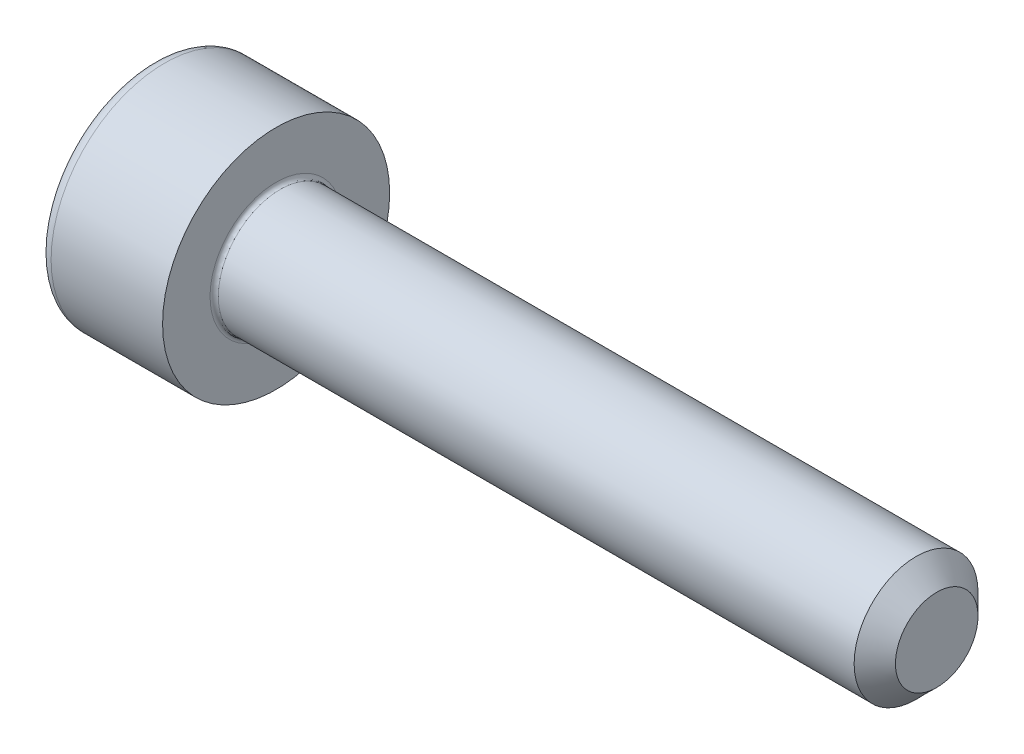
ISO-10303-21;
HEADER;
FILE_DESCRIPTION(('STEP AP214'),'2;1');
FILE_NAME('part.step','',(''),(''),'','','');
FILE_SCHEMA(('AUTOMOTIVE_DESIGN { 1 0 10303 214 1 1 1 1 }'));
ENDSEC;
DATA;
#1=APPLICATION_CONTEXT('core data for automotive mechanical design processes');
#2=APPLICATION_PROTOCOL_DEFINITION('international standard','automotive_design',2000,#1);
#3=PRODUCT_CONTEXT('',#1,'mechanical');
#4=PRODUCT('Part','Part','',(#3));
#5=PRODUCT_RELATED_PRODUCT_CATEGORY('part','',(#4));
#6=PRODUCT_DEFINITION_FORMATION('','',#4);
#7=PRODUCT_DEFINITION_CONTEXT('part definition',#1,'design');
#8=PRODUCT_DEFINITION('design','',#6,#7);
#9=PRODUCT_DEFINITION_SHAPE('','',#8);
#10=(LENGTH_UNIT() NAMED_UNIT(*) SI_UNIT(.MILLI.,.METRE.));
#11=(NAMED_UNIT(*) PLANE_ANGLE_UNIT() SI_UNIT($,.RADIAN.));
#12=(NAMED_UNIT(*) SI_UNIT($,.STERADIAN.) SOLID_ANGLE_UNIT());
#13=UNCERTAINTY_MEASURE_WITH_UNIT(LENGTH_MEASURE(1.E-05),#10,'distance_accuracy_value','');
#14=(GEOMETRIC_REPRESENTATION_CONTEXT(3) GLOBAL_UNCERTAINTY_ASSIGNED_CONTEXT((#13)) GLOBAL_UNIT_ASSIGNED_CONTEXT((#10,
#11,#12)) REPRESENTATION_CONTEXT('',''));
#15=CARTESIAN_POINT('',(0.,0.,0.));
#16=DIRECTION('',(0.,0.,1.));
#17=DIRECTION('',(1.,0.,0.));
#18=AXIS2_PLACEMENT_3D('',#15,#16,#17);
#19=CARTESIAN_POINT('',(0.1,0.,0.));
#20=DIRECTION('',(1.,0.,0.));
#21=DIRECTION('',(0.,-1.,0.));
#22=AXIS2_PLACEMENT_3D('',#19,#20,#21);
#23=TOROIDAL_SURFACE('',#22,1.6,0.1);
#24=CARTESIAN_POINT('',(0.,0.,0.));
#25=DIRECTION('',(1.,0.,0.));
#26=DIRECTION('',(0.,-1.,0.));
#27=AXIS2_PLACEMENT_3D('',#24,#25,#26);
#28=CIRCLE('',#27,1.6);
#29=CARTESIAN_POINT('',(0.,-1.6,0.));
#30=VERTEX_POINT('',#29);
#31=EDGE_CURVE('E210',#30,#30,#28,.T.);
#32=ORIENTED_EDGE('',*,*,#31,.T.);
#33=EDGE_LOOP('',(#32));
#34=FACE_BOUND('',#33,.T.);
#35=CARTESIAN_POINT('',(0.1,0.,0.));
#36=DIRECTION('',(-1.,0.,0.));
#37=DIRECTION('',(0.,0.,1.));
#38=AXIS2_PLACEMENT_3D('',#35,#36,#37);
#39=CIRCLE('',#38,1.5);
#40=CARTESIAN_POINT('',(0.1,0.,1.5));
#41=VERTEX_POINT('',#40);
#42=EDGE_CURVE('E211',#41,#41,#39,.T.);
#43=ORIENTED_EDGE('',*,*,#42,.T.);
#44=EDGE_LOOP('',(#43));
#45=FACE_BOUND('',#44,.T.);
#46=ADVANCED_FACE('F60',(#34,#45),#23,.F.);
#47=CARTESIAN_POINT('',(-2.7,0.,0.));
#48=DIRECTION('',(1.,0.,0.));
#49=DIRECTION('',(0.,0.,1.));
#50=AXIS2_PLACEMENT_3D('',#47,#48,#49);
#51=TOROIDAL_SURFACE('',#50,2.45,0.3);
#52=CARTESIAN_POINT('',(-3.,0.,0.));
#53=DIRECTION('',(1.,0.,0.));
#54=DIRECTION('',(0.,0.,1.));
#55=AXIS2_PLACEMENT_3D('',#52,#53,#54);
#56=CIRCLE('',#55,2.45);
#57=CARTESIAN_POINT('',(-3.,0.,2.45));
#58=VERTEX_POINT('',#57);
#59=EDGE_CURVE('E192',#58,#58,#56,.T.);
#60=ORIENTED_EDGE('',*,*,#59,.T.);
#61=EDGE_LOOP('',(#60));
#62=FACE_BOUND('',#61,.T.);
#63=CARTESIAN_POINT('',(-2.7,0.,0.));
#64=DIRECTION('',(1.,0.,0.));
#65=DIRECTION('',(0.,0.,1.));
#66=AXIS2_PLACEMENT_3D('',#63,#64,#65);
#67=CIRCLE('',#66,2.75);
#68=CARTESIAN_POINT('',(-2.7,0.,2.75));
#69=VERTEX_POINT('',#68);
#70=EDGE_CURVE('E201',#69,#69,#67,.T.);
#71=ORIENTED_EDGE('',*,*,#70,.F.);
#72=EDGE_LOOP('',(#71));
#73=FACE_BOUND('',#72,.T.);
#74=ADVANCED_FACE('F229',(#62,#73),#51,.T.);
#75=CARTESIAN_POINT('',(0.,0.,0.));
#76=DIRECTION('',(1.,0.,0.));
#77=DIRECTION('',(0.,0.,1.));
#78=AXIS2_PLACEMENT_3D('',#75,#76,#77);
#79=PLANE('',#78);
#80=ORIENTED_EDGE('',*,*,#31,.F.);
#81=EDGE_LOOP('',(#80));
#82=FACE_BOUND('',#81,.T.);
#83=CARTESIAN_POINT('',(0.,0.,0.));
#84=DIRECTION('',(1.,0.,0.));
#85=DIRECTION('',(0.,0.,1.));
#86=AXIS2_PLACEMENT_3D('',#83,#84,#85);
#87=CIRCLE('',#86,2.75);
#88=CARTESIAN_POINT('',(0.,0.,2.75));
#89=VERTEX_POINT('',#88);
#90=EDGE_CURVE('E197',#89,#89,#87,.T.);
#91=ORIENTED_EDGE('',*,*,#90,.T.);
#92=EDGE_LOOP('',(#91));
#93=FACE_BOUND('',#92,.T.);
#94=ADVANCED_FACE('F237',(#82,#93),#79,.T.);
#95=CARTESIAN_POINT('',(-3.,0.,0.));
#96=DIRECTION('',(1.,0.,0.));
#97=DIRECTION('',(0.,0.,1.));
#98=AXIS2_PLACEMENT_3D('',#95,#96,#97);
#99=CYLINDRICAL_SURFACE('',#98,2.75);
#100=ORIENTED_EDGE('',*,*,#70,.T.);
#101=EDGE_LOOP('',(#100));
#102=FACE_BOUND('',#101,.T.);
#103=ORIENTED_EDGE('',*,*,#90,.F.);
#104=EDGE_LOOP('',(#103));
#105=FACE_BOUND('',#104,.T.);
#106=ADVANCED_FACE('F265',(#102,#105),#99,.T.);
#107=CARTESIAN_POINT('',(0.133333333289239,-1.25,0.721687836487034));
#108=DIRECTION('',(0.,-0.5,0.866025403784439));
#109=DIRECTION('',(0.,0.866025403784439,0.5));
#110=AXIS2_PLACEMENT_3D('',#107,#108,#109);
#111=PLANE('',#110);
#112=CARTESIAN_POINT('',(-1.69999999999987,-1.25,0.721687836487035));
#113=CARTESIAN_POINT('',(-1.69738401948294,-1.24215203932499,0.726218858695339));
#114=CARTESIAN_POINT('',(-1.6922165499147,-1.22642783397098,0.735297232889276));
#115=CARTESIAN_POINT('',(-1.6846713619674,-1.20276898058198,0.748956678262127));
#116=CARTESIAN_POINT('',(-1.67733392896537,-1.17901516334059,0.762670951040728));
#117=CARTESIAN_POINT('',(-1.67021338001789,-1.15516514334506,0.776440766505325));
#118=CARTESIAN_POINT('',(-1.66253768859292,-1.12850348333736,0.791833883087814));
#119=CARTESIAN_POINT('',(-1.65367463731152,-1.09628003852828,0.810438097622551));
#120=CARTESIAN_POINT('',(-1.64360384312695,-1.05722065582976,0.832989042737921));
#121=CARTESIAN_POINT('',(-1.63372595374146,-1.01552255276089,0.857063453769432));
#122=CARTESIAN_POINT('',(-1.62415304160412,-0.971037529922755,0.882746893679936));
#123=CARTESIAN_POINT('',(-1.61437860911247,-0.920014398444216,0.912205112373968));
#124=CARTESIAN_POINT('',(-1.60493575093948,-0.861148465760758,0.94619137445486));
#125=CARTESIAN_POINT('',(-1.59763295469434,-0.802112128018892,0.980276019942097));
#126=CARTESIAN_POINT('',(-1.59322233484196,-0.753207018638113,1.00851139800784));
#127=CARTESIAN_POINT('',(-1.59067705349734,-0.71409478336521,1.03109285757126));
#128=CARTESIAN_POINT('',(-1.58915372065229,-0.679736799705594,1.05092944868595));
#129=CARTESIAN_POINT('',(-1.58834848889278,-0.644843445143961,1.07107513633504));
#130=CARTESIAN_POINT('',(-1.58829905866402,-0.609392767050834,1.09154259487506));
#131=CARTESIAN_POINT('',(-1.58903450088332,-0.573624128278051,1.11219362809907));
#132=CARTESIAN_POINT('',(-1.59056900030582,-0.537634757313027,1.13297210111369));
#133=CARTESIAN_POINT('',(-1.59289700232276,-0.501605681203261,1.15377349790432));
#134=CARTESIAN_POINT('',(-1.59601207891327,-0.465548040949067,1.17459138621142));
#135=CARTESIAN_POINT('',(-1.5999027213972,-0.429490466158829,1.19540923672289));
#136=CARTESIAN_POINT('',(-1.60455788341784,-0.393424641510312,1.21623185029226));
#137=CARTESIAN_POINT('',(-1.60995884670772,-0.357380152398952,1.2370421457835));
#138=CARTESIAN_POINT('',(-1.61608835380497,-0.321356169143508,1.25784060221332));
#139=CARTESIAN_POINT('',(-1.62292110031353,-0.285384285521163,1.27860897890593));
#140=CARTESIAN_POINT('',(-1.63043333920983,-0.249471247576269,1.29934338103084));
#141=CARTESIAN_POINT('',(-1.63859848012798,-0.213629543182003,1.32003659871108));
#142=CARTESIAN_POINT('',(-1.64739518608139,-0.17784538919857,1.34069658964614));
#143=CARTESIAN_POINT('',(-1.65679600883554,-0.142129567892932,1.36131712869128));
#144=CARTESIAN_POINT('',(-1.66677755965338,-0.10647502690417,1.38190228752897));
#145=CARTESIAN_POINT('',(-1.67731135856734,-0.0708929602258874,1.402445603304));
#146=CARTESIAN_POINT('',(-1.68837275186723,-0.0353810996675898,1.42294838555676));
#147=CARTESIAN_POINT('',(-1.69607201648135,-0.0117840267349489,1.43657216196651));
#148=CARTESIAN_POINT('',(-1.69999999999987,0.,1.44337567297407));
#149=B_SPLINE_CURVE_WITH_KNOTS('',3,(#112,#113,#114,#115,#116,#117,#118,#119,#120,#121,#122,
#123,#124,#125,#126,#127,#128,#129,#130,#131,#132,#133,#134,#135,#136,#137,#138,#139,#140,#141,
#142,#143,#144,#145,#146,#147,#148),.UNSPECIFIED.,.F.,.F.,(4,1,1,1,1,1,1,1,1,1,1,1,1,1,1,1,1,1,
1,1,1,1,1,1,1,1,1,1,1,1,1,1,1,1,4),(0.,0.0193286094422815,0.0386758778059963,0.0580433526518195,
0.0774601551828898,0.0969018530867074,0.122980681924948,0.155735511331439,0.191472868184122,
0.223581141428566,0.262696925229055,0.31374010739609,0.364073010828582,0.403001156408343,
0.429649119201364,0.456644552348079,0.48425991734535,0.51213956948865,0.54044675371789,
0.568839006632917,0.597298408954167,0.625777869427183,0.65433651245964,0.682914884875453,
0.711553298380966,0.740225079816359,0.768942792806602,0.797668936453434,0.826435603416019,
0.855234706304396,0.884091922636723,0.912980528265628,0.941935664746071,0.970940011129428,1.),.UNSPECIFIED.);
#150=CARTESIAN_POINT('',(-1.69999999999982,-1.25,0.721687836487035));
#151=VERTEX_POINT('',#150);
#152=CARTESIAN_POINT('',(-1.69999999999973,0.,1.44337567297407));
#153=VERTEX_POINT('',#152);
#154=EDGE_CURVE('E163',#151,#153,#149,.T.);
#155=ORIENTED_EDGE('',*,*,#154,.F.);
#156=DIRECTION('',(-1.,0.,0.));
#157=VECTOR('',#156,1.);
#158=CARTESIAN_POINT('',(-1.69999999999973,-1.25,0.721687836487034));
#159=LINE('',#158,#157);
#160=CARTESIAN_POINT('',(-3.,-1.25,0.721687836487033));
#161=VERTEX_POINT('',#160);
#162=EDGE_CURVE('E182',#151,#161,#159,.T.);
#163=ORIENTED_EDGE('',*,*,#162,.T.);
#164=DIRECTION('',(0.,0.866025403784439,0.5));
#165=VECTOR('',#164,1.);
#166=CARTESIAN_POINT('',(-3.,-1.25,0.721687836487034));
#167=LINE('',#166,#165);
#168=CARTESIAN_POINT('',(-3.,0.,1.44337567297407));
#169=VERTEX_POINT('',#168);
#170=EDGE_CURVE('E186',#161,#169,#167,.T.);
#171=ORIENTED_EDGE('',*,*,#170,.T.);
#172=DIRECTION('',(-1.,0.,0.));
#173=VECTOR('',#172,1.);
#174=CARTESIAN_POINT('',(-1.69999999999973,0.,1.44337567297407));
#175=LINE('',#174,#173);
#176=EDGE_CURVE('E126',#153,#169,#175,.T.);
#177=ORIENTED_EDGE('',*,*,#176,.F.);
#178=EDGE_LOOP('',(#155,#163,#171,#177));
#179=FACE_BOUND('',#178,.T.);
#180=ADVANCED_FACE('F258',(#179),#111,.F.);
#181=CARTESIAN_POINT('',(0.133333333289239,0.,1.44337567297407));
#182=DIRECTION('',(0.,0.5,0.866025403784439));
#183=DIRECTION('',(0.,0.866025403784439,-0.5));
#184=AXIS2_PLACEMENT_3D('',#181,#182,#183);
#185=PLANE('',#184);
#186=CARTESIAN_POINT('',(-1.69999999999987,0.,1.44337567297407));
#187=CARTESIAN_POINT('',(-1.69738401948294,0.00784796067500621,1.43884465076576));
#188=CARTESIAN_POINT('',(-1.6922165499147,0.0235721660290274,1.42976627657183));
#189=CARTESIAN_POINT('',(-1.6846713619674,0.0472310194180179,1.41610683119898));
#190=CARTESIAN_POINT('',(-1.67733392896537,0.0709848366594086,1.40239255842038));
#191=CARTESIAN_POINT('',(-1.67021338001789,0.0948348566549364,1.38862274295578));
#192=CARTESIAN_POINT('',(-1.66253768859292,0.121496516662632,1.3732296263733));
#193=CARTESIAN_POINT('',(-1.65367463731152,0.153719961471703,1.35462541183856));
#194=CARTESIAN_POINT('',(-1.64360384312696,0.192779344170216,1.3320744667232));
#195=CARTESIAN_POINT('',(-1.63372595374147,0.234477447239084,1.30800005569169));
#196=CARTESIAN_POINT('',(-1.62415304160413,0.278962470077212,1.28231661578119));
#197=CARTESIAN_POINT('',(-1.61437860911248,0.329985601555743,1.25285839708716));
#198=CARTESIAN_POINT('',(-1.60493575093949,0.38885153423919,1.21887213500627));
#199=CARTESIAN_POINT('',(-1.59763295469434,0.447887871981046,1.18478748951904));
#200=CARTESIAN_POINT('',(-1.59322233484197,0.496792981361817,1.15655211145331));
#201=CARTESIAN_POINT('',(-1.59067705349735,0.535905216634715,1.13397065188989));
#202=CARTESIAN_POINT('',(-1.58915372065229,0.570263200294327,1.1141340607752));
#203=CARTESIAN_POINT('',(-1.58834848889279,0.605156554855955,1.09398837312612));
#204=CARTESIAN_POINT('',(-1.58829905866402,0.640607232949079,1.0735209145861));
#205=CARTESIAN_POINT('',(-1.58903450088332,0.676375871721859,1.05286988136209));
#206=CARTESIAN_POINT('',(-1.59056900030581,0.712365242686879,1.03209140834747));
#207=CARTESIAN_POINT('',(-1.59289700232275,0.748394318796646,1.01129001155684));
#208=CARTESIAN_POINT('',(-1.59601207891326,0.784451959050839,0.990472123249737));
#209=CARTESIAN_POINT('',(-1.59990272139718,0.820509533841079,0.969654272738267));
#210=CARTESIAN_POINT('',(-1.60455788341783,0.856575358489599,0.948831659168899));
#211=CARTESIAN_POINT('',(-1.6099588467077,0.892619847600962,0.92802136367765));
#212=CARTESIAN_POINT('',(-1.61608835380496,0.928643830856412,0.907222907247834));
#213=CARTESIAN_POINT('',(-1.62292110031352,0.964615714478762,0.886454530555211));
#214=CARTESIAN_POINT('',(-1.63043333920981,1.00052875242366,0.865720128430306));
#215=CARTESIAN_POINT('',(-1.63859848012796,1.03637045681794,0.845026910750056));
#216=CARTESIAN_POINT('',(-1.64739518608137,1.07215461080138,0.824366919814993));
#217=CARTESIAN_POINT('',(-1.65679600883552,1.10787043210703,0.803746380769848));
#218=CARTESIAN_POINT('',(-1.66677755965337,1.1435249730958,0.783161221932148));
#219=CARTESIAN_POINT('',(-1.67731135856734,1.17910703977409,0.762617906157113));
#220=CARTESIAN_POINT('',(-1.68837275186723,1.2146189003324,0.742115123904349));
#221=CARTESIAN_POINT('',(-1.69607201648135,1.23821597326505,0.728491347494598));
#222=CARTESIAN_POINT('',(-1.69999999999986,1.25,0.721687836487037));
#223=B_SPLINE_CURVE_WITH_KNOTS('',3,(#186,#187,#188,#189,#190,#191,#192,#193,#194,#195,#196,
#197,#198,#199,#200,#201,#202,#203,#204,#205,#206,#207,#208,#209,#210,#211,#212,#213,#214,#215,
#216,#217,#218,#219,#220,#221,#222),.UNSPECIFIED.,.F.,.F.,(4,1,1,1,1,1,1,1,1,1,1,1,1,1,1,1,1,1,
1,1,1,1,1,1,1,1,1,1,1,1,1,1,1,1,4),(0.,0.0193286094422852,0.038675877805997,0.0580433526518165,
0.0774601551828836,0.096901853086698,0.122980681924932,0.155735511331419,0.191472868184097,
0.223581141428535,0.26269692522902,0.313740107396046,0.364073010828529,0.403001156408285,
0.429649119201302,0.456644552348014,0.484259917345281,0.512139569488578,0.540446753717816,
0.56883900663284,0.59729840895409,0.625777869427106,0.654336512459564,0.68291488487538,
0.711553298380895,0.740225079816292,0.768942792806539,0.797668936453377,0.82643560341597,
0.855234706304354,0.884091922636689,0.912980528265602,0.941935664746054,0.97094001112942,1.),.UNSPECIFIED.);
#224=CARTESIAN_POINT('',(-1.69999999999981,1.25,0.721687836487036));
#225=VERTEX_POINT('',#224);
#226=EDGE_CURVE('E161',#153,#225,#223,.T.);
#227=ORIENTED_EDGE('',*,*,#226,.F.);
#228=ORIENTED_EDGE('',*,*,#176,.T.);
#229=DIRECTION('',(0.,0.866025403784439,-0.5));
#230=VECTOR('',#229,1.);
#231=CARTESIAN_POINT('',(-3.,0.,1.44337567297407));
#232=LINE('',#231,#230);
#233=CARTESIAN_POINT('',(-3.,1.25,0.721687836487037));
#234=VERTEX_POINT('',#233);
#235=EDGE_CURVE('E131',#169,#234,#232,.T.);
#236=ORIENTED_EDGE('',*,*,#235,.T.);
#237=DIRECTION('',(-1.,0.,0.));
#238=VECTOR('',#237,1.);
#239=CARTESIAN_POINT('',(-1.69999999999973,1.25,0.721687836487036));
#240=LINE('',#239,#238);
#241=EDGE_CURVE('E118',#225,#234,#240,.T.);
#242=ORIENTED_EDGE('',*,*,#241,.F.);
#243=EDGE_LOOP('',(#227,#228,#236,#242));
#244=FACE_BOUND('',#243,.T.);
#245=ADVANCED_FACE('F134',(#244),#185,.F.);
#246=CARTESIAN_POINT('',(0.133333333289239,1.25,0.721687836487036));
#247=DIRECTION('',(0.,1.,0.));
#248=DIRECTION('',(0.,0.,-1.));
#249=AXIS2_PLACEMENT_3D('',#246,#247,#248);
#250=PLANE('',#249);
#251=CARTESIAN_POINT('',(-1.69999999999986,1.25,0.721687836487036));
#252=CARTESIAN_POINT('',(-1.69738401948294,1.25,0.712625792070429));
#253=CARTESIAN_POINT('',(-1.6922165499147,1.25,0.694469043682561));
#254=CARTESIAN_POINT('',(-1.6846713619674,1.25,0.667150152936864));
#255=CARTESIAN_POINT('',(-1.67733392896537,1.25,0.639721607379672));
#256=CARTESIAN_POINT('',(-1.67021338001789,1.25,0.612181976450485));
#257=CARTESIAN_POINT('',(-1.66253768859292,1.25,0.581395743285518));
#258=CARTESIAN_POINT('',(-1.65367463731153,1.25,0.544187314216054));
#259=CARTESIAN_POINT('',(-1.64360384312696,1.25,0.499085423985328));
#260=CARTESIAN_POINT('',(-1.63372595374147,1.25,0.450936601922322));
#261=CARTESIAN_POINT('',(-1.62415304160414,1.25,0.399569722101333));
#262=CARTESIAN_POINT('',(-1.61437860911249,1.25,0.340653284713289));
#263=CARTESIAN_POINT('',(-1.6049357509395,1.25,0.272680760551531));
#264=CARTESIAN_POINT('',(-1.59763295469435,1.25,0.204511469577086));
#265=CARTESIAN_POINT('',(-1.59322233484197,1.25,0.148040713445626));
#266=CARTESIAN_POINT('',(-1.59067705349735,1.25,0.102877794318804));
#267=CARTESIAN_POINT('',(-1.58915372065229,1.25,0.0632046120894322));
#268=CARTESIAN_POINT('',(-1.58834848889278,1.25,0.0229132367912671));
#269=CARTESIAN_POINT('',(-1.58829905866402,1.25,-0.0180216802887679));
#270=CARTESIAN_POINT('',(-1.58903450088331,1.25,-0.0593237467367864));
#271=CARTESIAN_POINT('',(-1.5905690003058,1.25,-0.100880692766023));
#272=CARTESIAN_POINT('',(-1.59289700232274,1.25,-0.142483486347277));
#273=CARTESIAN_POINT('',(-1.59601207891324,1.25,-0.18411926296148));
#274=CARTESIAN_POINT('',(-1.59990272139717,1.25,-0.225754963984424));
#275=CARTESIAN_POINT('',(-1.60455788341781,1.25,-0.267400191123166));
#276=CARTESIAN_POINT('',(-1.60995884670768,1.25,-0.309020782105669));
#277=CARTESIAN_POINT('',(-1.61608835380494,1.25,-0.350617694965311));
#278=CARTESIAN_POINT('',(-1.6229211003135,1.25,-0.392154448350565));
#279=CARTESIAN_POINT('',(-1.63043333920979,1.25,-0.433623252600389));
#280=CARTESIAN_POINT('',(-1.63859848012794,1.25,-0.475009687960901));
#281=CARTESIAN_POINT('',(-1.64739518608136,1.25,-0.516329669831042));
#282=CARTESIAN_POINT('',(-1.65679600883551,1.25,-0.557570747921346));
#283=CARTESIAN_POINT('',(-1.66677755965335,1.25,-0.598741065596762));
#284=CARTESIAN_POINT('',(-1.67731135856733,1.25,-0.63982769714685));
#285=CARTESIAN_POINT('',(-1.68837275186722,1.25,-0.680833261652393));
#286=CARTESIAN_POINT('',(-1.69607201648135,1.25,-0.708080814471907));
#287=CARTESIAN_POINT('',(-1.69999999999986,1.25,-0.721687836487034));
#288=B_SPLINE_CURVE_WITH_KNOTS('',3,(#251,#252,#253,#254,#255,#256,#257,#258,#259,#260,#261,
#262,#263,#264,#265,#266,#267,#268,#269,#270,#271,#272,#273,#274,#275,#276,#277,#278,#279,#280,
#281,#282,#283,#284,#285,#286,#287),.UNSPECIFIED.,.F.,.F.,(4,1,1,1,1,1,1,1,1,1,1,1,1,1,1,1,1,1,
1,1,1,1,1,1,1,1,1,1,1,1,1,1,1,1,4),(0.,0.0193286094422788,0.0386758778059875,0.0580433526518041,
0.0774601551828686,0.0969018530866802,0.122980681924911,0.155735511331393,0.191472868184064,
0.223581141428496,0.262696925228972,0.313740107395987,0.364073010828459,0.403001156408204,
0.429649119201216,0.456644552347923,0.484259917345186,0.51213956948848,0.540446753717715,
0.568839006632737,0.597298408953986,0.625777869427002,0.654336512459462,0.68291488487528,
0.7115532983808,0.740225079816202,0.768942792806457,0.797668936453302,0.826435603415904,
0.855234706304297,0.884091922636643,0.912980528265567,0.941935664746031,0.970940011129409,1.),.UNSPECIFIED.);
#289=CARTESIAN_POINT('',(-1.69999999999981,1.25,-0.721687836487034));
#290=VERTEX_POINT('',#289);
#291=EDGE_CURVE('E124',#225,#290,#288,.T.);
#292=ORIENTED_EDGE('',*,*,#291,.F.);
#293=ORIENTED_EDGE('',*,*,#241,.T.);
#294=DIRECTION('',(0.,0.,-1.));
#295=VECTOR('',#294,1.);
#296=CARTESIAN_POINT('',(-3.,1.25,0.721687836487036));
#297=LINE('',#296,#295);
#298=CARTESIAN_POINT('',(-3.,1.25,-0.721687836487035));
#299=VERTEX_POINT('',#298);
#300=EDGE_CURVE('E117',#234,#299,#297,.T.);
#301=ORIENTED_EDGE('',*,*,#300,.T.);
#302=DIRECTION('',(-1.,0.,0.));
#303=VECTOR('',#302,1.);
#304=CARTESIAN_POINT('',(-1.69999999999973,1.25,-0.721687836487034));
#305=LINE('',#304,#303);
#306=EDGE_CURVE('E129',#290,#299,#305,.T.);
#307=ORIENTED_EDGE('',*,*,#306,.F.);
#308=EDGE_LOOP('',(#292,#293,#301,#307));
#309=FACE_BOUND('',#308,.T.);
#310=ADVANCED_FACE('F116',(#309),#250,.F.);
#311=CARTESIAN_POINT('',(0.133333333289239,1.25,-0.721687836487034));
#312=DIRECTION('',(0.,0.5,-0.866025403784439));
#313=DIRECTION('',(0.,-0.866025403784439,-0.5));
#314=AXIS2_PLACEMENT_3D('',#311,#312,#313);
#315=PLANE('',#314);
#316=CARTESIAN_POINT('',(-1.69999999999986,1.25,-0.721687836487034));
#317=CARTESIAN_POINT('',(-1.69738401948294,1.24215203932499,-0.726218858695339));
#318=CARTESIAN_POINT('',(-1.6922165499147,1.22642783397097,-0.735297232889276));
#319=CARTESIAN_POINT('',(-1.6846713619674,1.20276898058198,-0.748956678262131));
#320=CARTESIAN_POINT('',(-1.67733392896536,1.17901516334058,-0.762670951040733));
#321=CARTESIAN_POINT('',(-1.67021338001788,1.15516514334504,-0.776440766505336));
#322=CARTESIAN_POINT('',(-1.66253768859291,1.12850348333733,-0.791833883087827));
#323=CARTESIAN_POINT('',(-1.65367463731151,1.09628003852824,-0.81043809762257));
#324=CARTESIAN_POINT('',(-1.64360384312694,1.05722065582971,-0.832989042737947));
#325=CARTESIAN_POINT('',(-1.63372595374144,1.01552255276083,-0.857063453769465));
#326=CARTESIAN_POINT('',(-1.62415304160411,0.971037529922679,-0.882746893679978));
#327=CARTESIAN_POINT('',(-1.61437860911245,0.920014398444122,-0.91220511237402));
#328=CARTESIAN_POINT('',(-1.60493575093946,0.861148465760644,-0.946191374454924));
#329=CARTESIAN_POINT('',(-1.59763295469432,0.802112128018757,-0.980276019942171));
#330=CARTESIAN_POINT('',(-1.59322233484195,0.753207018637962,-1.00851139800792));
#331=CARTESIAN_POINT('',(-1.59067705349733,0.714094783365046,-1.03109285757135));
#332=CARTESIAN_POINT('',(-1.58915372065228,0.67973679970542,-1.05092944868605));
#333=CARTESIAN_POINT('',(-1.58834848889278,0.644843445143779,-1.07107513633514));
#334=CARTESIAN_POINT('',(-1.58829905866403,0.609392767050644,-1.09154259487516));
#335=CARTESIAN_POINT('',(-1.58903450088333,0.573624128277854,-1.11219362809918));
#336=CARTESIAN_POINT('',(-1.59056900030583,0.537634757312828,-1.1329721011138));
#337=CARTESIAN_POINT('',(-1.59289700232277,0.501605681203059,-1.15377349790443));
#338=CARTESIAN_POINT('',(-1.59601207891328,0.465548040948867,-1.17459138621153));
#339=CARTESIAN_POINT('',(-1.59990272139722,0.429490466158631,-1.195409236723));
#340=CARTESIAN_POINT('',(-1.60455788341786,0.393424641510121,-1.21623185029236));
#341=CARTESIAN_POINT('',(-1.60995884670774,0.357380152398769,-1.23704214578361));
#342=CARTESIAN_POINT('',(-1.616088353805,0.321356169143335,-1.25784060221341));
#343=CARTESIAN_POINT('',(-1.62292110031356,0.285384285521004,-1.27860897890602));
#344=CARTESIAN_POINT('',(-1.63043333920986,0.249471247576124,-1.29934338103092));
#345=CARTESIAN_POINT('',(-1.63859848012801,0.213629543181873,-1.32003659871115));
#346=CARTESIAN_POINT('',(-1.64739518608141,0.177845389198457,-1.3406965896462));
#347=CARTESIAN_POINT('',(-1.65679600883556,0.142129567892837,-1.36131712869133));
#348=CARTESIAN_POINT('',(-1.66677755965339,0.106475026904096,-1.38190228752901));
#349=CARTESIAN_POINT('',(-1.67731135856736,0.0708929602258341,-1.40244560330403));
#350=CARTESIAN_POINT('',(-1.68837275186724,0.0353810996675606,-1.42294838555677));
#351=CARTESIAN_POINT('',(-1.69607201648136,0.0117840267349361,-1.43657216196651));
#352=CARTESIAN_POINT('',(-1.69999999999986,0.,-1.44337567297406));
#353=B_SPLINE_CURVE_WITH_KNOTS('',3,(#316,#317,#318,#319,#320,#321,#322,#323,#324,#325,#326,
#327,#328,#329,#330,#331,#332,#333,#334,#335,#336,#337,#338,#339,#340,#341,#342,#343,#344,#345,
#346,#347,#348,#349,#350,#351,#352),.UNSPECIFIED.,.F.,.F.,(4,1,1,1,1,1,1,1,1,1,1,1,1,1,1,1,1,1,
1,1,1,1,1,1,1,1,1,1,1,1,1,1,1,1,4),(0.,0.0193286094422844,0.038675877806003,0.0580433526518305,
0.0774601551829062,0.09690185308673,0.122980681924976,0.155735511331478,0.191472868184172,
0.223581141428625,0.262696925229127,0.31374010739618,0.364073010828688,0.403001156408462,
0.429649119201491,0.456644552348215,0.484259917345492,0.512139569488797,0.540446753718042,
0.568839006633072,0.597298408954323,0.625777869427339,0.654336512459793,0.682914884875602,
0.711553298381108,0.740225079816493,0.768942792806725,0.797668936453546,0.82643560341612,
0.855234706304484,0.884091922636796,0.912980528265685,0.941935664746111,0.97094001112945,1.),.UNSPECIFIED.);
#354=CARTESIAN_POINT('',(-1.69999999999973,0.,-1.44337567297406));
#355=VERTEX_POINT('',#354);
#356=EDGE_CURVE('E351',#290,#355,#353,.T.);
#357=ORIENTED_EDGE('',*,*,#356,.F.);
#358=ORIENTED_EDGE('',*,*,#306,.T.);
#359=DIRECTION('',(0.,-0.866025403784439,-0.5));
#360=VECTOR('',#359,1.);
#361=CARTESIAN_POINT('',(-3.,1.25,-0.721687836487034));
#362=LINE('',#361,#360);
#363=CARTESIAN_POINT('',(-3.,0.,-1.44337567297406));
#364=VERTEX_POINT('',#363);
#365=EDGE_CURVE('E148',#299,#364,#362,.T.);
#366=ORIENTED_EDGE('',*,*,#365,.T.);
#367=DIRECTION('',(-1.,0.,0.));
#368=VECTOR('',#367,1.);
#369=CARTESIAN_POINT('',(-1.69999999999973,0.,-1.44337567297406));
#370=LINE('',#369,#368);
#371=EDGE_CURVE('E159',#355,#364,#370,.T.);
#372=ORIENTED_EDGE('',*,*,#371,.F.);
#373=EDGE_LOOP('',(#357,#358,#366,#372));
#374=FACE_BOUND('',#373,.T.);
#375=ADVANCED_FACE('F249',(#374),#315,.F.);
#376=CARTESIAN_POINT('',(0.133333333289239,0.,-1.44337567297406));
#377=DIRECTION('',(0.,-0.5,-0.866025403784438));
#378=DIRECTION('',(0.,-0.866025403784438,0.5));
#379=AXIS2_PLACEMENT_3D('',#376,#377,#378);
#380=PLANE('',#379);
#381=CARTESIAN_POINT('',(-1.69999999999986,0.,-1.44337567297406));
#382=CARTESIAN_POINT('',(-1.69738401948294,-0.00784796067500364,-1.43884465076576));
#383=CARTESIAN_POINT('',(-1.6922165499147,-0.0235721660290173,-1.42976627657183));
#384=CARTESIAN_POINT('',(-1.6846713619674,-0.047231019418001,-1.41610683119898));
#385=CARTESIAN_POINT('',(-1.67733392896537,-0.0709848366593899,-1.40239255842038));
#386=CARTESIAN_POINT('',(-1.67021338001789,-0.0948348566549163,-1.38862274295579));
#387=CARTESIAN_POINT('',(-1.66253768859292,-0.121496516662611,-1.3732296263733));
#388=CARTESIAN_POINT('',(-1.65367463731153,-0.153719961471681,-1.35462541183857));
#389=CARTESIAN_POINT('',(-1.64360384312696,-0.192779344170191,-1.3320744667232));
#390=CARTESIAN_POINT('',(-1.63372595374147,-0.234477447239055,-1.3080000556917));
#391=CARTESIAN_POINT('',(-1.62415304160413,-0.27896247007718,-1.2823166157812));
#392=CARTESIAN_POINT('',(-1.61437860911248,-0.329985601555706,-1.25285839708718));
#393=CARTESIAN_POINT('',(-1.60493575093949,-0.388851534239146,-1.21887213500629));
#394=CARTESIAN_POINT('',(-1.59763295469434,-0.447887871980996,-1.18478748951907));
#395=CARTESIAN_POINT('',(-1.59322233484197,-0.496792981361762,-1.15655211145333));
#396=CARTESIAN_POINT('',(-1.59067705349735,-0.535905216634655,-1.13397065188992));
#397=CARTESIAN_POINT('',(-1.58915372065229,-0.570263200294263,-1.11413406077523));
#398=CARTESIAN_POINT('',(-1.58834848889278,-0.605156554855889,-1.09398837312615));
#399=CARTESIAN_POINT('',(-1.58829905866402,-0.640607232949011,-1.07352091458613));
#400=CARTESIAN_POINT('',(-1.58903450088332,-0.67637587172179,-1.05286988136212));
#401=CARTESIAN_POINT('',(-1.5905690003058,-0.712365242686809,-1.0320914083475));
#402=CARTESIAN_POINT('',(-1.59289700232274,-0.748394318796576,-1.01129001155687));
#403=CARTESIAN_POINT('',(-1.59601207891325,-0.784451959050769,-0.990472123249772));
#404=CARTESIAN_POINT('',(-1.59990272139717,-0.820509533841012,-0.9696542727383));
#405=CARTESIAN_POINT('',(-1.60455788341782,-0.856575358489533,-0.94883165916893));
#406=CARTESIAN_POINT('',(-1.60995884670769,-0.892619847600901,-0.92802136367768));
#407=CARTESIAN_POINT('',(-1.61608835380495,-0.928643830856355,-0.907222907247861));
#408=CARTESIAN_POINT('',(-1.62292110031351,-0.964615714478711,-0.886454530555236));
#409=CARTESIAN_POINT('',(-1.6304333392098,-1.00052875242362,-0.865720128430327));
#410=CARTESIAN_POINT('',(-1.63859848012795,-1.0363704568179,-0.845026910750073));
#411=CARTESIAN_POINT('',(-1.64739518608136,-1.07215461080135,-0.824366919815006));
#412=CARTESIAN_POINT('',(-1.65679600883552,-1.107870432107,-0.803746380769857));
#413=CARTESIAN_POINT('',(-1.66677755965336,-1.14352497309578,-0.783161221932152));
#414=CARTESIAN_POINT('',(-1.67731135856733,-1.17910703977408,-0.762617906157112));
#415=CARTESIAN_POINT('',(-1.68837275186723,-1.2146189003324,-0.742115123904345));
#416=CARTESIAN_POINT('',(-1.69607201648135,-1.23821597326505,-0.728491347494592));
#417=CARTESIAN_POINT('',(-1.69999999999986,-1.25,-0.72168783648703));
#418=B_SPLINE_CURVE_WITH_KNOTS('',3,(#381,#382,#383,#384,#385,#386,#387,#388,#389,#390,#391,
#392,#393,#394,#395,#396,#397,#398,#399,#400,#401,#402,#403,#404,#405,#406,#407,#408,#409,#410,
#411,#412,#413,#414,#415,#416,#417),.UNSPECIFIED.,.F.,.F.,(4,1,1,1,1,1,1,1,1,1,1,1,1,1,1,1,1,1,
1,1,1,1,1,1,1,1,1,1,1,1,1,1,1,1,4),(0.,0.019328609442274,0.0386758778059845,0.0580433526518032,
0.0774601551828703,0.0969018530866851,0.122980681924919,0.155735511331404,0.191472868184079,
0.223581141428515,0.262696925228994,0.313740107396015,0.364073010828492,0.403001156408242,
0.429649119201256,0.456644552347965,0.48425991734523,0.512139569488526,0.540446753717762,
0.568839006632785,0.597298408954035,0.625777869427051,0.65433651245951,0.682914884875327,
0.711553298380845,0.740225079816245,0.768942792806496,0.797668936453339,0.826435603415936,
0.855234706304325,0.884091922636666,0.912980528265586,0.941935664746044,0.970940011129416,1.),.UNSPECIFIED.);
#419=CARTESIAN_POINT('',(-1.69999999999981,-1.25,-0.721687836487031));
#420=VERTEX_POINT('',#419);
#421=EDGE_CURVE('E344',#355,#420,#418,.T.);
#422=ORIENTED_EDGE('',*,*,#421,.F.);
#423=ORIENTED_EDGE('',*,*,#371,.T.);
#424=DIRECTION('',(0.,-0.866025403784438,0.5));
#425=VECTOR('',#424,1.);
#426=CARTESIAN_POINT('',(-3.,0.,-1.44337567297406));
#427=LINE('',#426,#425);
#428=CARTESIAN_POINT('',(-3.,-1.25,-0.721687836487028));
#429=VERTEX_POINT('',#428);
#430=EDGE_CURVE('E151',#364,#429,#427,.T.);
#431=ORIENTED_EDGE('',*,*,#430,.T.);
#432=DIRECTION('',(-1.,0.,0.));
#433=VECTOR('',#432,1.);
#434=CARTESIAN_POINT('',(-1.69999999999973,-1.25,-0.721687836487031));
#435=LINE('',#434,#433);
#436=EDGE_CURVE('E190',#420,#429,#435,.T.);
#437=ORIENTED_EDGE('',*,*,#436,.F.);
#438=EDGE_LOOP('',(#422,#423,#431,#437));
#439=FACE_BOUND('',#438,.T.);
#440=ADVANCED_FACE('F242',(#439),#380,.F.);
#441=CARTESIAN_POINT('',(0.133333333289239,-1.25,-0.721687836487031));
#442=DIRECTION('',(0.,-1.,0.));
#443=DIRECTION('',(0.,0.,1.));
#444=AXIS2_PLACEMENT_3D('',#441,#442,#443);
#445=PLANE('',#444);
#446=CARTESIAN_POINT('',(-1.69999999999986,-1.25,-0.72168783648703));
#447=CARTESIAN_POINT('',(-1.68952620537607,-1.25000000098073,-0.685402704109452));
#448=CARTESIAN_POINT('',(-1.66882662532746,-1.25000000047391,-0.609426524114409));
#449=CARTESIAN_POINT('',(-1.64216462328561,-1.24999999653124,-0.495567471339054));
#450=CARTESIAN_POINT('',(-1.62091524111501,-1.25000000079919,-0.384284635832132));
#451=CARTESIAN_POINT('',(-1.60602622647925,-1.24999999982635,-0.283416065071795));
#452=CARTESIAN_POINT('',(-1.59595460164164,-1.25000000004584,-0.18912397710867));
#453=CARTESIAN_POINT('',(-1.58979451832237,-1.2499999999877,-0.096121255574874));
#454=CARTESIAN_POINT('',(-1.58834722259695,-1.24999999999578,-0.0325311952212167));
#455=CARTESIAN_POINT('',(-1.58835450315953,-1.24999999999987,0.));
#456=B_SPLINE_CURVE_WITH_KNOTS('',3,(#446,#447,#448,#449,#450,#451,#452,#453,#454,#455),
.UNSPECIFIED.,.F.,.F.,(4,1,1,1,1,1,1,4),(0.,0.15464663082682,0.32233761678327,0.478698544215034,
0.61840543615109,0.739680361911978,0.866888771115841,1.),.UNSPECIFIED.);
#457=CARTESIAN_POINT('',(-1.58835450315953,-1.24999999999987,0.));
#458=VERTEX_POINT('',#457);
#459=EDGE_CURVE('E355',#420,#458,#456,.T.);
#460=ORIENTED_EDGE('',*,*,#459,.F.);
#461=ORIENTED_EDGE('',*,*,#436,.T.);
#462=DIRECTION('',(0.,0.,1.));
#463=VECTOR('',#462,1.);
#464=CARTESIAN_POINT('',(-3.,-1.25,-0.721687836487031));
#465=LINE('',#464,#463);
#466=EDGE_CURVE('E191',#429,#161,#465,.T.);
#467=ORIENTED_EDGE('',*,*,#466,.T.);
#468=ORIENTED_EDGE('',*,*,#162,.F.);
#469=CARTESIAN_POINT('',(-1.58835450315953,-1.24999999999987,0.));
#470=CARTESIAN_POINT('',(-1.58834655337041,-1.24999999999995,0.0332113064453385));
#471=CARTESIAN_POINT('',(-1.58986890770249,-1.25000000000002,0.0986999582225013));
#472=CARTESIAN_POINT('',(-1.5964399058259,-1.25,0.195338682543529));
#473=CARTESIAN_POINT('',(-1.60788370358651,-1.25,0.298925607584719));
#474=CARTESIAN_POINT('',(-1.62512567463451,-1.25,0.409278174253511));
#475=CARTESIAN_POINT('',(-1.64887876229215,-1.25,0.526138809119023));
#476=CARTESIAN_POINT('',(-1.67430736459291,-1.25,0.629971803135887));
#477=CARTESIAN_POINT('',(-1.69219697844036,-1.25,0.694656343300826));
#478=CARTESIAN_POINT('',(-1.69999999999987,-1.25,0.721687836487035));
#479=B_SPLINE_CURVE_WITH_KNOTS('',3,(#469,#470,#471,#472,#473,#474,#475,#476,#477,#478),
.UNSPECIFIED.,.F.,.F.,(4,1,1,1,1,1,1,4),(0.,0.135881251771568,0.268088734046202,
0.396575364343073,0.562487499680676,0.725224599421058,0.884758394713962,1.),.UNSPECIFIED.);
#480=EDGE_CURVE('E140',#458,#151,#479,.T.);
#481=ORIENTED_EDGE('',*,*,#480,.F.);
#482=EDGE_LOOP('',(#460,#461,#467,#468,#481));
#483=FACE_BOUND('',#482,.T.);
#484=ADVANCED_FACE('F245',(#483),#445,.F.);
#485=CARTESIAN_POINT('',(-1.28333333335538,0.,0.));
#486=DIRECTION('',(-1.,0.,0.));
#487=DIRECTION('',(0.,1.,0.));
#488=AXIS2_PLACEMENT_3D('',#485,#486,#487);
#489=CONICAL_SURFACE('',#488,0.721687836487032,1.04719755121951);
#490=CARTESIAN_POINT('',(-0.866666666710761,0.,0.));
#491=VERTEX_POINT('',#490);
#492=VERTEX_LOOP('',#491);
#493=FACE_BOUND('',#492,.T.);
#494=ORIENTED_EDGE('',*,*,#480,.T.);
#495=ORIENTED_EDGE('',*,*,#154,.T.);
#496=ORIENTED_EDGE('',*,*,#226,.T.);
#497=ORIENTED_EDGE('',*,*,#291,.T.);
#498=ORIENTED_EDGE('',*,*,#356,.T.);
#499=ORIENTED_EDGE('',*,*,#421,.T.);
#500=ORIENTED_EDGE('',*,*,#459,.T.);
#501=EDGE_LOOP('',(#494,#495,#496,#497,#498,#499,#500));
#502=FACE_BOUND('',#501,.T.);
#503=ADVANCED_FACE('F244',(#493,#502),#489,.F.);
#504=CARTESIAN_POINT('',(-3.,0.,0.));
#505=DIRECTION('',(-1.,0.,0.));
#506=DIRECTION('',(0.,0.,1.));
#507=AXIS2_PLACEMENT_3D('',#504,#505,#506);
#508=PLANE('',#507);
#509=ORIENTED_EDGE('',*,*,#170,.F.);
#510=ORIENTED_EDGE('',*,*,#466,.F.);
#511=ORIENTED_EDGE('',*,*,#430,.F.);
#512=ORIENTED_EDGE('',*,*,#365,.F.);
#513=ORIENTED_EDGE('',*,*,#300,.F.);
#514=ORIENTED_EDGE('',*,*,#235,.F.);
#515=EDGE_LOOP('',(#509,#510,#511,#512,#513,#514));
#516=FACE_BOUND('',#515,.T.);
#517=ORIENTED_EDGE('',*,*,#59,.F.);
#518=EDGE_LOOP('',(#517));
#519=FACE_BOUND('',#518,.T.);
#520=ADVANCED_FACE('F142',(#516,#519),#508,.T.);
#521=CARTESIAN_POINT('',(16.,0.,0.));
#522=DIRECTION('',(-1.,0.,0.));
#523=DIRECTION('',(0.,0.,1.));
#524=AXIS2_PLACEMENT_3D('',#521,#522,#523);
#525=CYLINDRICAL_SURFACE('',#524,1.5);
#526=CARTESIAN_POINT('',(15.5,0.,0.));
#527=DIRECTION('',(1.,0.,0.));
#528=DIRECTION('',(0.,0.,-1.));
#529=AXIS2_PLACEMENT_3D('',#526,#527,#528);
#530=CIRCLE('',#529,1.5);
#531=CARTESIAN_POINT('',(15.5,0.,-1.5));
#532=VERTEX_POINT('',#531);
#533=EDGE_CURVE('E11',#532,#532,#530,.F.);
#534=ORIENTED_EDGE('',*,*,#533,.T.);
#535=EDGE_LOOP('',(#534));
#536=FACE_BOUND('',#535,.T.);
#537=ORIENTED_EDGE('',*,*,#42,.F.);
#538=EDGE_LOOP('',(#537));
#539=FACE_BOUND('',#538,.T.);
#540=ADVANCED_FACE('F223',(#536,#539),#525,.T.);
#541=CARTESIAN_POINT('',(16.,0.,0.));
#542=DIRECTION('',(1.,0.,0.));
#543=DIRECTION('',(0.,0.,-1.));
#544=AXIS2_PLACEMENT_3D('',#541,#542,#543);
#545=PLANE('',#544);
#546=CARTESIAN_POINT('',(16.,0.,0.));
#547=DIRECTION('',(1.,0.,0.));
#548=DIRECTION('',(0.,0.,-1.));
#549=AXIS2_PLACEMENT_3D('',#546,#547,#548);
#550=CIRCLE('',#549,1.);
#551=CARTESIAN_POINT('',(16.,0.,-1.));
#552=VERTEX_POINT('',#551);
#553=EDGE_CURVE('E69',#552,#552,#550,.T.);
#554=ORIENTED_EDGE('',*,*,#553,.T.);
#555=EDGE_LOOP('',(#554));
#556=FACE_BOUND('',#555,.T.);
#557=ADVANCED_FACE('F217',(#556),#545,.T.);
#558=CARTESIAN_POINT('',(16.,0.,0.));
#559=DIRECTION('',(-1.,0.,0.));
#560=DIRECTION('',(0.,0.,1.));
#561=AXIS2_PLACEMENT_3D('',#558,#559,#560);
#562=CONICAL_SURFACE('',#561,1.,0.785398163397444);
#563=ORIENTED_EDGE('',*,*,#533,.F.);
#564=EDGE_LOOP('',(#563));
#565=FACE_BOUND('',#564,.T.);
#566=ORIENTED_EDGE('',*,*,#553,.F.);
#567=EDGE_LOOP('',(#566));
#568=FACE_BOUND('',#567,.T.);
#569=ADVANCED_FACE('F58',(#565,#568),#562,.T.);
#570=CLOSED_SHELL('',(#46,#74,#94,#106,#180,#245,#310,#375,#440,#484,#503,#520,#540,#557,#569));
#571=MANIFOLD_SOLID_BREP('B2',#570);
#572=ADVANCED_BREP_SHAPE_REPRESENTATION('',(#18,#571),#14);
#573=SHAPE_DEFINITION_REPRESENTATION(#9,#572);
ENDSEC;
END-ISO-10303-21;
